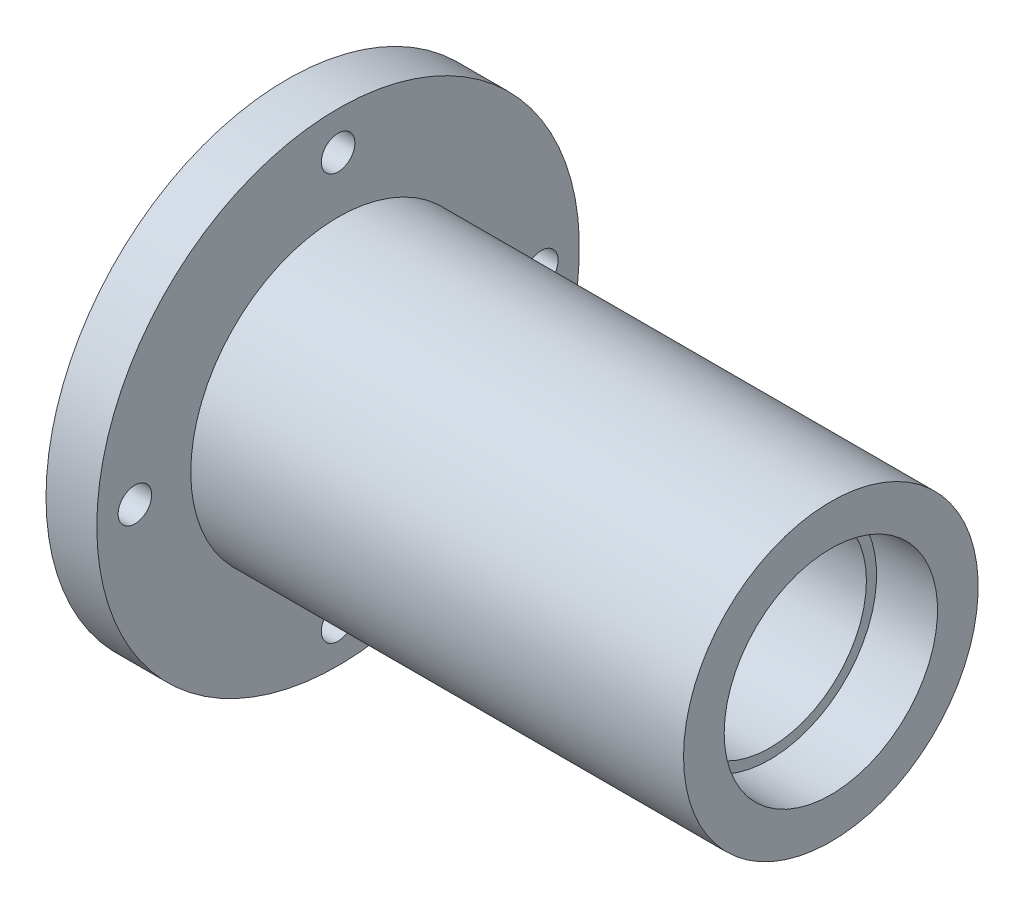
ISO-10303-21;
HEADER;
FILE_DESCRIPTION(('STEP AP214'),'2;1');
FILE_NAME('part.step','',(''),(''),'','','');
FILE_SCHEMA(('AUTOMOTIVE_DESIGN { 1 0 10303 214 1 1 1 1 }'));
ENDSEC;
DATA;
#1=APPLICATION_CONTEXT('core data for automotive mechanical design processes');
#2=APPLICATION_PROTOCOL_DEFINITION('international standard','automotive_design',2000,#1);
#3=PRODUCT_CONTEXT('',#1,'mechanical');
#4=PRODUCT('Part','Part','',(#3));
#5=PRODUCT_RELATED_PRODUCT_CATEGORY('part','',(#4));
#6=PRODUCT_DEFINITION_FORMATION('','',#4);
#7=PRODUCT_DEFINITION_CONTEXT('part definition',#1,'design');
#8=PRODUCT_DEFINITION('design','',#6,#7);
#9=PRODUCT_DEFINITION_SHAPE('','',#8);
#10=(LENGTH_UNIT() NAMED_UNIT(*) SI_UNIT(.MILLI.,.METRE.));
#11=(NAMED_UNIT(*) PLANE_ANGLE_UNIT() SI_UNIT($,.RADIAN.));
#12=(NAMED_UNIT(*) SI_UNIT($,.STERADIAN.) SOLID_ANGLE_UNIT());
#13=UNCERTAINTY_MEASURE_WITH_UNIT(LENGTH_MEASURE(1.E-05),#10,'distance_accuracy_value','');
#14=(GEOMETRIC_REPRESENTATION_CONTEXT(3) GLOBAL_UNCERTAINTY_ASSIGNED_CONTEXT((#13)) GLOBAL_UNIT_ASSIGNED_CONTEXT((#10,
#11,#12)) REPRESENTATION_CONTEXT('',''));
#15=CARTESIAN_POINT('',(0.,0.,0.));
#16=DIRECTION('',(0.,0.,1.));
#17=DIRECTION('',(1.,0.,0.));
#18=AXIS2_PLACEMENT_3D('',#15,#16,#17);
#19=CARTESIAN_POINT('',(-23.2546239210851,0.,0.));
#20=DIRECTION('',(-1.,0.,0.));
#21=DIRECTION('',(0.,0.,1.));
#22=AXIS2_PLACEMENT_3D('',#19,#20,#21);
#23=CYLINDRICAL_SURFACE('',#22,30.);
#24=CARTESIAN_POINT('',(0.,0.,0.));
#25=DIRECTION('',(-1.,0.,0.));
#26=DIRECTION('',(0.,0.,1.));
#27=AXIS2_PLACEMENT_3D('',#24,#25,#26);
#28=CIRCLE('',#27,30.);
#29=CARTESIAN_POINT('',(0.,0.,30.));
#30=VERTEX_POINT('',#29);
#31=EDGE_CURVE('E10',#30,#30,#28,.T.);
#32=ORIENTED_EDGE('',*,*,#31,.F.);
#33=EDGE_LOOP('',(#32));
#34=FACE_BOUND('',#33,.T.);
#35=CARTESIAN_POINT('',(3.,0.,0.));
#36=DIRECTION('',(-1.,0.,0.));
#37=DIRECTION('',(0.,0.,1.));
#38=AXIS2_PLACEMENT_3D('',#35,#36,#37);
#39=CIRCLE('',#38,30.);
#40=CARTESIAN_POINT('',(3.,0.,30.));
#41=VERTEX_POINT('',#40);
#42=EDGE_CURVE('E50',#41,#41,#39,.T.);
#43=ORIENTED_EDGE('',*,*,#42,.T.);
#44=EDGE_LOOP('',(#43));
#45=FACE_BOUND('',#44,.T.);
#46=ADVANCED_FACE('F31',(#34,#45),#23,.T.);
#47=CARTESIAN_POINT('',(0.,22.5,0.));
#48=DIRECTION('',(1.,0.,0.));
#49=DIRECTION('',(0.,0.,-1.));
#50=AXIS2_PLACEMENT_3D('',#47,#48,#49);
#51=PLANE('',#50);
#52=CARTESIAN_POINT('',(0.,0.,0.));
#53=DIRECTION('',(-1.,0.,0.));
#54=DIRECTION('',(0.,0.,1.));
#55=AXIS2_PLACEMENT_3D('',#52,#53,#54);
#56=CIRCLE('',#55,22.5);
#57=CARTESIAN_POINT('',(0.,0.,22.5));
#58=VERTEX_POINT('',#57);
#59=EDGE_CURVE('E38',#58,#58,#56,.T.);
#60=ORIENTED_EDGE('',*,*,#59,.F.);
#61=EDGE_LOOP('',(#60));
#62=FACE_BOUND('',#61,.T.);
#63=ORIENTED_EDGE('',*,*,#31,.T.);
#64=EDGE_LOOP('',(#63));
#65=FACE_BOUND('',#64,.T.);
#66=ADVANCED_FACE('F111',(#62,#65),#51,.F.);
#67=CARTESIAN_POINT('',(-23.2546239210851,0.,0.));
#68=DIRECTION('',(-1.,0.,0.));
#69=DIRECTION('',(0.,0.,1.));
#70=AXIS2_PLACEMENT_3D('',#67,#68,#69);
#71=CYLINDRICAL_SURFACE('',#70,22.5);
#72=CARTESIAN_POINT('',(20.,0.,0.));
#73=DIRECTION('',(-1.,0.,0.));
#74=DIRECTION('',(0.,0.,1.));
#75=AXIS2_PLACEMENT_3D('',#72,#73,#74);
#76=CIRCLE('',#75,22.5);
#77=CARTESIAN_POINT('',(20.,0.,22.5));
#78=VERTEX_POINT('',#77);
#79=EDGE_CURVE('E43',#78,#78,#76,.T.);
#80=ORIENTED_EDGE('',*,*,#79,.F.);
#81=EDGE_LOOP('',(#80));
#82=FACE_BOUND('',#81,.T.);
#83=ORIENTED_EDGE('',*,*,#59,.T.);
#84=EDGE_LOOP('',(#83));
#85=FACE_BOUND('',#84,.T.);
#86=ADVANCED_FACE('F108',(#82,#85),#71,.F.);
#87=CARTESIAN_POINT('',(20.,21.,0.));
#88=DIRECTION('',(1.,0.,0.));
#89=DIRECTION('',(0.,0.,-1.));
#90=AXIS2_PLACEMENT_3D('',#87,#88,#89);
#91=PLANE('',#90);
#92=CARTESIAN_POINT('',(20.,0.,0.));
#93=DIRECTION('',(-1.,0.,0.));
#94=DIRECTION('',(0.,0.,1.));
#95=AXIS2_PLACEMENT_3D('',#92,#93,#94);
#96=CIRCLE('',#95,21.);
#97=CARTESIAN_POINT('',(20.,0.,21.));
#98=VERTEX_POINT('',#97);
#99=EDGE_CURVE('E101',#98,#98,#96,.T.);
#100=ORIENTED_EDGE('',*,*,#99,.F.);
#101=EDGE_LOOP('',(#100));
#102=FACE_BOUND('',#101,.T.);
#103=ORIENTED_EDGE('',*,*,#79,.T.);
#104=EDGE_LOOP('',(#103));
#105=FACE_BOUND('',#104,.T.);
#106=ADVANCED_FACE('F106',(#102,#105),#91,.F.);
#107=CARTESIAN_POINT('',(-23.2546239210851,0.,0.));
#108=DIRECTION('',(-1.,0.,0.));
#109=DIRECTION('',(0.,0.,1.));
#110=AXIS2_PLACEMENT_3D('',#107,#108,#109);
#111=CYLINDRICAL_SURFACE('',#110,21.);
#112=CARTESIAN_POINT('',(32.,0.,0.));
#113=DIRECTION('',(-1.,0.,0.));
#114=DIRECTION('',(0.,0.,1.));
#115=AXIS2_PLACEMENT_3D('',#112,#113,#114);
#116=CIRCLE('',#115,21.);
#117=CARTESIAN_POINT('',(32.,0.,21.));
#118=VERTEX_POINT('',#117);
#119=EDGE_CURVE('E98',#118,#118,#116,.T.);
#120=ORIENTED_EDGE('',*,*,#119,.F.);
#121=EDGE_LOOP('',(#120));
#122=FACE_BOUND('',#121,.T.);
#123=ORIENTED_EDGE('',*,*,#99,.T.);
#124=EDGE_LOOP('',(#123));
#125=FACE_BOUND('',#124,.T.);
#126=ADVANCED_FACE('F123',(#122,#125),#111,.F.);
#127=CARTESIAN_POINT('',(32.,19.,0.));
#128=DIRECTION('',(1.,0.,0.));
#129=DIRECTION('',(0.,0.,-1.));
#130=AXIS2_PLACEMENT_3D('',#127,#128,#129);
#131=PLANE('',#130);
#132=CARTESIAN_POINT('',(32.,0.,0.));
#133=DIRECTION('',(-1.,0.,0.));
#134=DIRECTION('',(0.,0.,1.));
#135=AXIS2_PLACEMENT_3D('',#132,#133,#134);
#136=CIRCLE('',#135,19.);
#137=CARTESIAN_POINT('',(32.,0.,19.));
#138=VERTEX_POINT('',#137);
#139=EDGE_CURVE('E95',#138,#138,#136,.T.);
#140=ORIENTED_EDGE('',*,*,#139,.F.);
#141=EDGE_LOOP('',(#140));
#142=FACE_BOUND('',#141,.T.);
#143=ORIENTED_EDGE('',*,*,#119,.T.);
#144=EDGE_LOOP('',(#143));
#145=FACE_BOUND('',#144,.T.);
#146=ADVANCED_FACE('F127',(#142,#145),#131,.F.);
#147=CARTESIAN_POINT('',(-23.2546239210851,0.,0.));
#148=DIRECTION('',(-1.,0.,0.));
#149=DIRECTION('',(0.,0.,1.));
#150=AXIS2_PLACEMENT_3D('',#147,#148,#149);
#151=CYLINDRICAL_SURFACE('',#150,19.);
#152=CARTESIAN_POINT('',(98.,0.,0.));
#153=DIRECTION('',(-1.,0.,0.));
#154=DIRECTION('',(0.,0.,1.));
#155=AXIS2_PLACEMENT_3D('',#152,#153,#154);
#156=CIRCLE('',#155,19.);
#157=CARTESIAN_POINT('',(98.,0.,19.));
#158=VERTEX_POINT('',#157);
#159=EDGE_CURVE('E92',#158,#158,#156,.T.);
#160=ORIENTED_EDGE('',*,*,#159,.F.);
#161=EDGE_LOOP('',(#160));
#162=FACE_BOUND('',#161,.T.);
#163=ORIENTED_EDGE('',*,*,#139,.T.);
#164=EDGE_LOOP('',(#163));
#165=FACE_BOUND('',#164,.T.);
#166=ADVANCED_FACE('F131',(#162,#165),#151,.F.);
#167=CARTESIAN_POINT('',(98.,21.,0.));
#168=DIRECTION('',(-1.,0.,0.));
#169=DIRECTION('',(0.,0.,1.));
#170=AXIS2_PLACEMENT_3D('',#167,#168,#169);
#171=PLANE('',#170);
#172=CARTESIAN_POINT('',(98.,0.,0.));
#173=DIRECTION('',(-1.,0.,0.));
#174=DIRECTION('',(0.,0.,1.));
#175=AXIS2_PLACEMENT_3D('',#172,#173,#174);
#176=CIRCLE('',#175,21.);
#177=CARTESIAN_POINT('',(98.,0.,21.));
#178=VERTEX_POINT('',#177);
#179=EDGE_CURVE('E89',#178,#178,#176,.T.);
#180=ORIENTED_EDGE('',*,*,#179,.F.);
#181=EDGE_LOOP('',(#180));
#182=FACE_BOUND('',#181,.T.);
#183=ORIENTED_EDGE('',*,*,#159,.T.);
#184=EDGE_LOOP('',(#183));
#185=FACE_BOUND('',#184,.T.);
#186=ADVANCED_FACE('F135',(#182,#185),#171,.F.);
#187=CARTESIAN_POINT('',(-23.2546239210851,0.,0.));
#188=DIRECTION('',(-1.,0.,0.));
#189=DIRECTION('',(0.,0.,1.));
#190=AXIS2_PLACEMENT_3D('',#187,#188,#189);
#191=CYLINDRICAL_SURFACE('',#190,21.);
#192=CARTESIAN_POINT('',(110.,0.,0.));
#193=DIRECTION('',(-1.,0.,0.));
#194=DIRECTION('',(0.,0.,1.));
#195=AXIS2_PLACEMENT_3D('',#192,#193,#194);
#196=CIRCLE('',#195,21.);
#197=CARTESIAN_POINT('',(110.,0.,21.));
#198=VERTEX_POINT('',#197);
#199=EDGE_CURVE('E86',#198,#198,#196,.T.);
#200=ORIENTED_EDGE('',*,*,#199,.F.);
#201=EDGE_LOOP('',(#200));
#202=FACE_BOUND('',#201,.T.);
#203=ORIENTED_EDGE('',*,*,#179,.T.);
#204=EDGE_LOOP('',(#203));
#205=FACE_BOUND('',#204,.T.);
#206=ADVANCED_FACE('F139',(#202,#205),#191,.F.);
#207=CARTESIAN_POINT('',(110.,29.,0.));
#208=DIRECTION('',(-1.,0.,0.));
#209=DIRECTION('',(0.,0.,1.));
#210=AXIS2_PLACEMENT_3D('',#207,#208,#209);
#211=PLANE('',#210);
#212=CARTESIAN_POINT('',(110.,0.,0.));
#213=DIRECTION('',(-1.,0.,0.));
#214=DIRECTION('',(0.,0.,1.));
#215=AXIS2_PLACEMENT_3D('',#212,#213,#214);
#216=CIRCLE('',#215,29.);
#217=CARTESIAN_POINT('',(110.,0.,29.));
#218=VERTEX_POINT('',#217);
#219=EDGE_CURVE('E83',#218,#218,#216,.T.);
#220=ORIENTED_EDGE('',*,*,#219,.F.);
#221=EDGE_LOOP('',(#220));
#222=FACE_BOUND('',#221,.T.);
#223=ORIENTED_EDGE('',*,*,#199,.T.);
#224=EDGE_LOOP('',(#223));
#225=FACE_BOUND('',#224,.T.);
#226=ADVANCED_FACE('F143',(#222,#225),#211,.F.);
#227=CARTESIAN_POINT('',(-23.2546239210851,0.,0.));
#228=DIRECTION('',(-1.,0.,0.));
#229=DIRECTION('',(0.,0.,1.));
#230=AXIS2_PLACEMENT_3D('',#227,#228,#229);
#231=CYLINDRICAL_SURFACE('',#230,29.);
#232=CARTESIAN_POINT('',(13.,0.,0.));
#233=DIRECTION('',(-1.,0.,0.));
#234=DIRECTION('',(0.,0.,1.));
#235=AXIS2_PLACEMENT_3D('',#232,#233,#234);
#236=CIRCLE('',#235,29.);
#237=CARTESIAN_POINT('',(13.,0.,29.));
#238=VERTEX_POINT('',#237);
#239=EDGE_CURVE('E80',#238,#238,#236,.T.);
#240=ORIENTED_EDGE('',*,*,#239,.F.);
#241=EDGE_LOOP('',(#240));
#242=FACE_BOUND('',#241,.T.);
#243=ORIENTED_EDGE('',*,*,#219,.T.);
#244=EDGE_LOOP('',(#243));
#245=FACE_BOUND('',#244,.T.);
#246=ADVANCED_FACE('F147',(#242,#245),#231,.T.);
#247=CARTESIAN_POINT('',(13.,47.5,0.));
#248=DIRECTION('',(-1.,0.,0.));
#249=DIRECTION('',(0.,0.,1.));
#250=AXIS2_PLACEMENT_3D('',#247,#248,#249);
#251=PLANE('',#250);
#252=CARTESIAN_POINT('',(13.,40.,0.));
#253=DIRECTION('',(-1.,0.,0.));
#254=DIRECTION('',(0.,0.,1.));
#255=AXIS2_PLACEMENT_3D('',#252,#253,#254);
#256=CIRCLE('',#255,3.29999999999999);
#257=CARTESIAN_POINT('',(13.,40.,3.29999999999999));
#258=VERTEX_POINT('',#257);
#259=EDGE_CURVE('E34',#258,#258,#256,.T.);
#260=ORIENTED_EDGE('',*,*,#259,.T.);
#261=EDGE_LOOP('',(#260));
#262=FACE_BOUND('',#261,.T.);
#263=CARTESIAN_POINT('',(13.,0.,40.));
#264=DIRECTION('',(-1.,0.,0.));
#265=DIRECTION('',(0.,0.,1.));
#266=AXIS2_PLACEMENT_3D('',#263,#264,#265);
#267=CIRCLE('',#266,3.29999999999999);
#268=CARTESIAN_POINT('',(13.,0.,43.3));
#269=VERTEX_POINT('',#268);
#270=EDGE_CURVE('E55',#269,#269,#267,.T.);
#271=ORIENTED_EDGE('',*,*,#270,.T.);
#272=EDGE_LOOP('',(#271));
#273=FACE_BOUND('',#272,.T.);
#274=CARTESIAN_POINT('',(13.,0.,-40.));
#275=DIRECTION('',(-1.,0.,0.));
#276=DIRECTION('',(0.,0.,1.));
#277=AXIS2_PLACEMENT_3D('',#274,#275,#276);
#278=CIRCLE('',#277,3.29999999999999);
#279=CARTESIAN_POINT('',(13.,0.,-36.7));
#280=VERTEX_POINT('',#279);
#281=EDGE_CURVE('E52',#280,#280,#278,.T.);
#282=ORIENTED_EDGE('',*,*,#281,.T.);
#283=EDGE_LOOP('',(#282));
#284=FACE_BOUND('',#283,.T.);
#285=CARTESIAN_POINT('',(13.,-40.,0.));
#286=DIRECTION('',(-1.,0.,0.));
#287=DIRECTION('',(0.,0.,1.));
#288=AXIS2_PLACEMENT_3D('',#285,#286,#287);
#289=CIRCLE('',#288,3.29999999999999);
#290=CARTESIAN_POINT('',(13.,-40.,3.29999999999999));
#291=VERTEX_POINT('',#290);
#292=EDGE_CURVE('E47',#291,#291,#289,.T.);
#293=ORIENTED_EDGE('',*,*,#292,.T.);
#294=EDGE_LOOP('',(#293));
#295=FACE_BOUND('',#294,.T.);
#296=CARTESIAN_POINT('',(13.,0.,0.));
#297=DIRECTION('',(-1.,0.,0.));
#298=DIRECTION('',(0.,0.,1.));
#299=AXIS2_PLACEMENT_3D('',#296,#297,#298);
#300=CIRCLE('',#299,47.5);
#301=CARTESIAN_POINT('',(13.,0.,47.5));
#302=VERTEX_POINT('',#301);
#303=EDGE_CURVE('E77',#302,#302,#300,.T.);
#304=ORIENTED_EDGE('',*,*,#303,.F.);
#305=EDGE_LOOP('',(#304));
#306=FACE_BOUND('',#305,.T.);
#307=ORIENTED_EDGE('',*,*,#239,.T.);
#308=EDGE_LOOP('',(#307));
#309=FACE_BOUND('',#308,.T.);
#310=ADVANCED_FACE('F151',(#262,#273,#284,#295,#306,#309),#251,.F.);
#311=CARTESIAN_POINT('',(-23.2546239210851,0.,0.));
#312=DIRECTION('',(-1.,0.,0.));
#313=DIRECTION('',(0.,0.,1.));
#314=AXIS2_PLACEMENT_3D('',#311,#312,#313);
#315=CYLINDRICAL_SURFACE('',#314,47.5);
#316=CARTESIAN_POINT('',(3.,0.,0.));
#317=DIRECTION('',(-1.,0.,0.));
#318=DIRECTION('',(0.,0.,1.));
#319=AXIS2_PLACEMENT_3D('',#316,#317,#318);
#320=CIRCLE('',#319,47.5);
#321=CARTESIAN_POINT('',(3.,0.,47.5));
#322=VERTEX_POINT('',#321);
#323=EDGE_CURVE('E74',#322,#322,#320,.T.);
#324=ORIENTED_EDGE('',*,*,#323,.F.);
#325=EDGE_LOOP('',(#324));
#326=FACE_BOUND('',#325,.T.);
#327=ORIENTED_EDGE('',*,*,#303,.T.);
#328=EDGE_LOOP('',(#327));
#329=FACE_BOUND('',#328,.T.);
#330=ADVANCED_FACE('F155',(#326,#329),#315,.T.);
#331=CARTESIAN_POINT('',(3.,30.,0.));
#332=DIRECTION('',(1.,0.,0.));
#333=DIRECTION('',(0.,0.,-1.));
#334=AXIS2_PLACEMENT_3D('',#331,#332,#333);
#335=PLANE('',#334);
#336=CARTESIAN_POINT('',(3.,40.,0.));
#337=DIRECTION('',(-1.,0.,0.));
#338=DIRECTION('',(0.,0.,1.));
#339=AXIS2_PLACEMENT_3D('',#336,#337,#338);
#340=CIRCLE('',#339,3.29999999999999);
#341=CARTESIAN_POINT('',(3.,40.,3.29999999999999));
#342=VERTEX_POINT('',#341);
#343=EDGE_CURVE('E67',#342,#342,#340,.T.);
#344=ORIENTED_EDGE('',*,*,#343,.F.);
#345=EDGE_LOOP('',(#344));
#346=FACE_BOUND('',#345,.T.);
#347=CARTESIAN_POINT('',(3.,0.,40.));
#348=DIRECTION('',(-1.,0.,0.));
#349=DIRECTION('',(0.,0.,1.));
#350=AXIS2_PLACEMENT_3D('',#347,#348,#349);
#351=CIRCLE('',#350,3.29999999999999);
#352=CARTESIAN_POINT('',(3.,0.,43.3));
#353=VERTEX_POINT('',#352);
#354=EDGE_CURVE('E57',#353,#353,#351,.T.);
#355=ORIENTED_EDGE('',*,*,#354,.F.);
#356=EDGE_LOOP('',(#355));
#357=FACE_BOUND('',#356,.T.);
#358=CARTESIAN_POINT('',(3.,0.,-40.));
#359=DIRECTION('',(-1.,0.,0.));
#360=DIRECTION('',(0.,0.,1.));
#361=AXIS2_PLACEMENT_3D('',#358,#359,#360);
#362=CIRCLE('',#361,3.29999999999999);
#363=CARTESIAN_POINT('',(3.,0.,-36.7));
#364=VERTEX_POINT('',#363);
#365=EDGE_CURVE('E54',#364,#364,#362,.T.);
#366=ORIENTED_EDGE('',*,*,#365,.F.);
#367=EDGE_LOOP('',(#366));
#368=FACE_BOUND('',#367,.T.);
#369=CARTESIAN_POINT('',(3.,-40.,0.));
#370=DIRECTION('',(-1.,0.,0.));
#371=DIRECTION('',(0.,0.,1.));
#372=AXIS2_PLACEMENT_3D('',#369,#370,#371);
#373=CIRCLE('',#372,3.29999999999999);
#374=CARTESIAN_POINT('',(3.,-40.,3.29999999999999));
#375=VERTEX_POINT('',#374);
#376=EDGE_CURVE('E51',#375,#375,#373,.T.);
#377=ORIENTED_EDGE('',*,*,#376,.F.);
#378=EDGE_LOOP('',(#377));
#379=FACE_BOUND('',#378,.T.);
#380=ORIENTED_EDGE('',*,*,#42,.F.);
#381=EDGE_LOOP('',(#380));
#382=FACE_BOUND('',#381,.T.);
#383=ORIENTED_EDGE('',*,*,#323,.T.);
#384=EDGE_LOOP('',(#383));
#385=FACE_BOUND('',#384,.T.);
#386=ADVANCED_FACE('F159',(#346,#357,#368,#379,#382,#385),#335,.F.);
#387=CARTESIAN_POINT('',(3.,-40.,0.));
#388=DIRECTION('',(-1.,0.,0.));
#389=DIRECTION('',(0.,0.,1.));
#390=AXIS2_PLACEMENT_3D('',#387,#388,#389);
#391=CYLINDRICAL_SURFACE('',#390,3.29999999999999);
#392=ORIENTED_EDGE('',*,*,#376,.T.);
#393=EDGE_LOOP('',(#392));
#394=FACE_BOUND('',#393,.T.);
#395=ORIENTED_EDGE('',*,*,#292,.F.);
#396=EDGE_LOOP('',(#395));
#397=FACE_BOUND('',#396,.T.);
#398=ADVANCED_FACE('F163',(#394,#397),#391,.F.);
#399=CARTESIAN_POINT('',(3.,0.,-40.));
#400=DIRECTION('',(-1.,0.,0.));
#401=DIRECTION('',(0.,0.,1.));
#402=AXIS2_PLACEMENT_3D('',#399,#400,#401);
#403=CYLINDRICAL_SURFACE('',#402,3.29999999999999);
#404=ORIENTED_EDGE('',*,*,#365,.T.);
#405=EDGE_LOOP('',(#404));
#406=FACE_BOUND('',#405,.T.);
#407=ORIENTED_EDGE('',*,*,#281,.F.);
#408=EDGE_LOOP('',(#407));
#409=FACE_BOUND('',#408,.T.);
#410=ADVANCED_FACE('F167',(#406,#409),#403,.F.);
#411=CARTESIAN_POINT('',(3.,0.,40.));
#412=DIRECTION('',(-1.,0.,0.));
#413=DIRECTION('',(0.,0.,1.));
#414=AXIS2_PLACEMENT_3D('',#411,#412,#413);
#415=CYLINDRICAL_SURFACE('',#414,3.29999999999999);
#416=ORIENTED_EDGE('',*,*,#354,.T.);
#417=EDGE_LOOP('',(#416));
#418=FACE_BOUND('',#417,.T.);
#419=ORIENTED_EDGE('',*,*,#270,.F.);
#420=EDGE_LOOP('',(#419));
#421=FACE_BOUND('',#420,.T.);
#422=ADVANCED_FACE('F171',(#418,#421),#415,.F.);
#423=CARTESIAN_POINT('',(3.,40.,0.));
#424=DIRECTION('',(-1.,0.,0.));
#425=DIRECTION('',(0.,0.,1.));
#426=AXIS2_PLACEMENT_3D('',#423,#424,#425);
#427=CYLINDRICAL_SURFACE('',#426,3.29999999999999);
#428=ORIENTED_EDGE('',*,*,#343,.T.);
#429=EDGE_LOOP('',(#428));
#430=FACE_BOUND('',#429,.T.);
#431=ORIENTED_EDGE('',*,*,#259,.F.);
#432=EDGE_LOOP('',(#431));
#433=FACE_BOUND('',#432,.T.);
#434=ADVANCED_FACE('F175',(#430,#433),#427,.F.);
#435=CLOSED_SHELL('',(#46,#66,#86,#106,#126,#146,#166,#186,#206,#226,#246,#310,#330,#386,#398,
#410,#422,#434));
#436=MANIFOLD_SOLID_BREP('B2',#435);
#437=ADVANCED_BREP_SHAPE_REPRESENTATION('',(#18,#436),#14);
#438=SHAPE_DEFINITION_REPRESENTATION(#9,#437);
ENDSEC;
END-ISO-10303-21;
